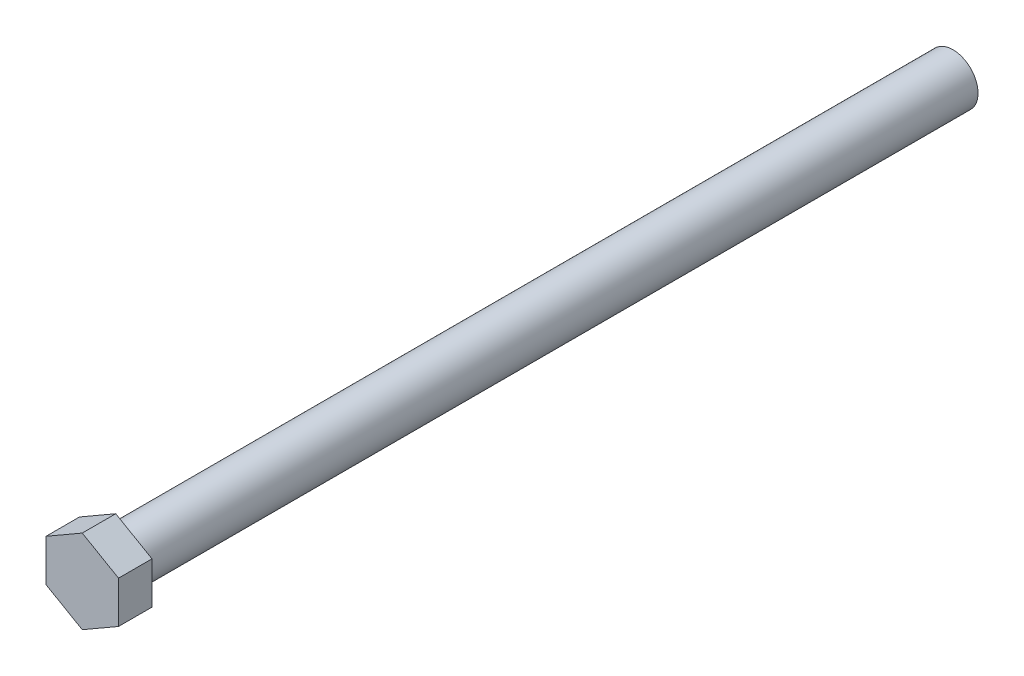
ISO-10303-21;
HEADER;
FILE_DESCRIPTION(('STEP AP214'),'2;1');
FILE_NAME('part.step','',(''),(''),'','','');
FILE_SCHEMA(('AUTOMOTIVE_DESIGN { 1 0 10303 214 1 1 1 1 }'));
ENDSEC;
DATA;
#1=APPLICATION_CONTEXT('core data for automotive mechanical design processes');
#2=APPLICATION_PROTOCOL_DEFINITION('international standard','automotive_design',2000,#1);
#3=PRODUCT_CONTEXT('',#1,'mechanical');
#4=PRODUCT('Part','Part','',(#3));
#5=PRODUCT_RELATED_PRODUCT_CATEGORY('part','',(#4));
#6=PRODUCT_DEFINITION_FORMATION('','',#4);
#7=PRODUCT_DEFINITION_CONTEXT('part definition',#1,'design');
#8=PRODUCT_DEFINITION('design','',#6,#7);
#9=PRODUCT_DEFINITION_SHAPE('','',#8);
#10=(LENGTH_UNIT() NAMED_UNIT(*) SI_UNIT(.MILLI.,.METRE.));
#11=(NAMED_UNIT(*) PLANE_ANGLE_UNIT() SI_UNIT($,.RADIAN.));
#12=(NAMED_UNIT(*) SI_UNIT($,.STERADIAN.) SOLID_ANGLE_UNIT());
#13=UNCERTAINTY_MEASURE_WITH_UNIT(LENGTH_MEASURE(1.E-05),#10,'distance_accuracy_value','');
#14=(GEOMETRIC_REPRESENTATION_CONTEXT(3) GLOBAL_UNCERTAINTY_ASSIGNED_CONTEXT((#13)) GLOBAL_UNIT_ASSIGNED_CONTEXT((#10,
#11,#12)) REPRESENTATION_CONTEXT('',''));
#15=CARTESIAN_POINT('',(0.,0.,0.));
#16=DIRECTION('',(0.,0.,1.));
#17=DIRECTION('',(1.,0.,0.));
#18=AXIS2_PLACEMENT_3D('',#15,#16,#17);
#19=CARTESIAN_POINT('',(0.,5.,4.));
#20=DIRECTION('',(0.5,-0.866025403784439,0.));
#21=DIRECTION('',(0.866025403784439,0.5,0.));
#22=AXIS2_PLACEMENT_3D('',#19,#20,#21);
#23=PLANE('',#22);
#24=DIRECTION('',(-0.866025403784439,-0.5,0.));
#25=VECTOR('',#24,1.);
#26=CARTESIAN_POINT('',(0.,5.,0.));
#27=LINE('',#26,#25);
#28=CARTESIAN_POINT('',(0.,5.,0.));
#29=VERTEX_POINT('',#28);
#30=CARTESIAN_POINT('',(-4.3301270189222,2.5,0.));
#31=VERTEX_POINT('',#30);
#32=EDGE_CURVE('E136',#29,#31,#27,.T.);
#33=ORIENTED_EDGE('',*,*,#32,.T.);
#34=DIRECTION('',(0.,0.,-1.));
#35=VECTOR('',#34,1.);
#36=CARTESIAN_POINT('',(-4.3301270189222,2.5,4.));
#37=LINE('',#36,#35);
#38=CARTESIAN_POINT('',(-4.3301270189222,2.5,4.));
#39=VERTEX_POINT('',#38);
#40=EDGE_CURVE('E48',#39,#31,#37,.T.);
#41=ORIENTED_EDGE('',*,*,#40,.F.);
#42=DIRECTION('',(-0.866025403784439,-0.5,0.));
#43=VECTOR('',#42,1.);
#44=CARTESIAN_POINT('',(0.,5.,4.));
#45=LINE('',#44,#43);
#46=CARTESIAN_POINT('',(0.,5.,4.));
#47=VERTEX_POINT('',#46);
#48=EDGE_CURVE('E153',#47,#39,#45,.T.);
#49=ORIENTED_EDGE('',*,*,#48,.F.);
#50=DIRECTION('',(0.,0.,-1.));
#51=VECTOR('',#50,1.);
#52=CARTESIAN_POINT('',(0.,5.,4.));
#53=LINE('',#52,#51);
#54=EDGE_CURVE('E132',#47,#29,#53,.T.);
#55=ORIENTED_EDGE('',*,*,#54,.T.);
#56=EDGE_LOOP('',(#33,#41,#49,#55));
#57=FACE_BOUND('',#56,.T.);
#58=ADVANCED_FACE('F45',(#57),#23,.F.);
#59=CARTESIAN_POINT('',(-4.3301270189222,2.5,4.));
#60=DIRECTION('',(1.,0.,0.));
#61=DIRECTION('',(0.,1.,0.));
#62=AXIS2_PLACEMENT_3D('',#59,#60,#61);
#63=PLANE('',#62);
#64=DIRECTION('',(0.,-1.,0.));
#65=VECTOR('',#64,1.);
#66=CARTESIAN_POINT('',(-4.3301270189222,2.5,0.));
#67=LINE('',#66,#65);
#68=CARTESIAN_POINT('',(-4.3301270189222,-2.5,0.));
#69=VERTEX_POINT('',#68);
#70=EDGE_CURVE('E140',#31,#69,#67,.T.);
#71=ORIENTED_EDGE('',*,*,#70,.T.);
#72=DIRECTION('',(0.,0.,-1.));
#73=VECTOR('',#72,1.);
#74=CARTESIAN_POINT('',(-4.3301270189222,-2.5,4.));
#75=LINE('',#74,#73);
#76=CARTESIAN_POINT('',(-4.3301270189222,-2.5,4.));
#77=VERTEX_POINT('',#76);
#78=EDGE_CURVE('E159',#77,#69,#75,.T.);
#79=ORIENTED_EDGE('',*,*,#78,.F.);
#80=DIRECTION('',(0.,-1.,0.));
#81=VECTOR('',#80,1.);
#82=CARTESIAN_POINT('',(-4.3301270189222,2.5,4.));
#83=LINE('',#82,#81);
#84=EDGE_CURVE('E101',#39,#77,#83,.T.);
#85=ORIENTED_EDGE('',*,*,#84,.F.);
#86=ORIENTED_EDGE('',*,*,#40,.T.);
#87=EDGE_LOOP('',(#71,#79,#85,#86));
#88=FACE_BOUND('',#87,.T.);
#89=ADVANCED_FACE('F166',(#88),#63,.F.);
#90=CARTESIAN_POINT('',(-4.3301270189222,-2.5,4.));
#91=DIRECTION('',(0.5,0.866025403784439,0.));
#92=DIRECTION('',(-0.866025403784439,0.5,0.));
#93=AXIS2_PLACEMENT_3D('',#90,#91,#92);
#94=PLANE('',#93);
#95=DIRECTION('',(0.866025403784439,-0.5,0.));
#96=VECTOR('',#95,1.);
#97=CARTESIAN_POINT('',(-4.3301270189222,-2.5,0.));
#98=LINE('',#97,#96);
#99=CARTESIAN_POINT('',(0.,-5.,0.));
#100=VERTEX_POINT('',#99);
#101=EDGE_CURVE('E144',#69,#100,#98,.T.);
#102=ORIENTED_EDGE('',*,*,#101,.T.);
#103=DIRECTION('',(0.,0.,-1.));
#104=VECTOR('',#103,1.);
#105=CARTESIAN_POINT('',(0.,-5.,4.));
#106=LINE('',#105,#104);
#107=CARTESIAN_POINT('',(0.,-5.,4.));
#108=VERTEX_POINT('',#107);
#109=EDGE_CURVE('E125',#108,#100,#106,.T.);
#110=ORIENTED_EDGE('',*,*,#109,.F.);
#111=DIRECTION('',(0.866025403784439,-0.5,0.));
#112=VECTOR('',#111,1.);
#113=CARTESIAN_POINT('',(-4.3301270189222,-2.5,4.));
#114=LINE('',#113,#112);
#115=EDGE_CURVE('E114',#77,#108,#114,.T.);
#116=ORIENTED_EDGE('',*,*,#115,.F.);
#117=ORIENTED_EDGE('',*,*,#78,.T.);
#118=EDGE_LOOP('',(#102,#110,#116,#117));
#119=FACE_BOUND('',#118,.T.);
#120=ADVANCED_FACE('F172',(#119),#94,.F.);
#121=CARTESIAN_POINT('',(0.,-5.,4.));
#122=DIRECTION('',(-0.5,0.866025403784439,0.));
#123=DIRECTION('',(-0.866025403784439,-0.5,0.));
#124=AXIS2_PLACEMENT_3D('',#121,#122,#123);
#125=PLANE('',#124);
#126=DIRECTION('',(0.866025403784439,0.5,0.));
#127=VECTOR('',#126,1.);
#128=CARTESIAN_POINT('',(0.,-5.,0.));
#129=LINE('',#128,#127);
#130=CARTESIAN_POINT('',(4.3301270189222,-2.5,0.));
#131=VERTEX_POINT('',#130);
#132=EDGE_CURVE('E123',#100,#131,#129,.T.);
#133=ORIENTED_EDGE('',*,*,#132,.T.);
#134=DIRECTION('',(0.,0.,-1.));
#135=VECTOR('',#134,1.);
#136=CARTESIAN_POINT('',(4.3301270189222,-2.5,4.));
#137=LINE('',#136,#135);
#138=CARTESIAN_POINT('',(4.3301270189222,-2.5,4.));
#139=VERTEX_POINT('',#138);
#140=EDGE_CURVE('E120',#139,#131,#137,.T.);
#141=ORIENTED_EDGE('',*,*,#140,.F.);
#142=DIRECTION('',(0.866025403784439,0.5,0.));
#143=VECTOR('',#142,1.);
#144=CARTESIAN_POINT('',(0.,-5.,4.));
#145=LINE('',#144,#143);
#146=EDGE_CURVE('E108',#108,#139,#145,.T.);
#147=ORIENTED_EDGE('',*,*,#146,.F.);
#148=ORIENTED_EDGE('',*,*,#109,.T.);
#149=EDGE_LOOP('',(#133,#141,#147,#148));
#150=FACE_BOUND('',#149,.T.);
#151=ADVANCED_FACE('F121',(#150),#125,.F.);
#152=CARTESIAN_POINT('',(4.3301270189222,-2.5,4.));
#153=DIRECTION('',(-1.,0.,0.));
#154=DIRECTION('',(0.,-1.,0.));
#155=AXIS2_PLACEMENT_3D('',#152,#153,#154);
#156=PLANE('',#155);
#157=DIRECTION('',(0.,1.,0.));
#158=VECTOR('',#157,1.);
#159=CARTESIAN_POINT('',(4.3301270189222,-2.5,0.));
#160=LINE('',#159,#158);
#161=CARTESIAN_POINT('',(4.3301270189222,2.5,0.));
#162=VERTEX_POINT('',#161);
#163=EDGE_CURVE('E86',#131,#162,#160,.T.);
#164=ORIENTED_EDGE('',*,*,#163,.T.);
#165=DIRECTION('',(0.,0.,-1.));
#166=VECTOR('',#165,1.);
#167=CARTESIAN_POINT('',(4.3301270189222,2.5,4.));
#168=LINE('',#167,#166);
#169=CARTESIAN_POINT('',(4.3301270189222,2.5,4.));
#170=VERTEX_POINT('',#169);
#171=EDGE_CURVE('E126',#170,#162,#168,.T.);
#172=ORIENTED_EDGE('',*,*,#171,.F.);
#173=DIRECTION('',(0.,1.,0.));
#174=VECTOR('',#173,1.);
#175=CARTESIAN_POINT('',(4.3301270189222,-2.5,4.));
#176=LINE('',#175,#174);
#177=EDGE_CURVE('E112',#139,#170,#176,.T.);
#178=ORIENTED_EDGE('',*,*,#177,.F.);
#179=ORIENTED_EDGE('',*,*,#140,.T.);
#180=EDGE_LOOP('',(#164,#172,#178,#179));
#181=FACE_BOUND('',#180,.T.);
#182=ADVANCED_FACE('F128',(#181),#156,.F.);
#183=CARTESIAN_POINT('',(4.3301270189222,2.5,4.));
#184=DIRECTION('',(-0.5,-0.866025403784439,0.));
#185=DIRECTION('',(0.866025403784439,-0.5,0.));
#186=AXIS2_PLACEMENT_3D('',#183,#184,#185);
#187=PLANE('',#186);
#188=DIRECTION('',(-0.866025403784439,0.5,0.));
#189=VECTOR('',#188,1.);
#190=CARTESIAN_POINT('',(4.3301270189222,2.5,0.));
#191=LINE('',#190,#189);
#192=EDGE_CURVE('E92',#162,#29,#191,.T.);
#193=ORIENTED_EDGE('',*,*,#192,.T.);
#194=ORIENTED_EDGE('',*,*,#54,.F.);
#195=DIRECTION('',(-0.866025403784439,0.5,0.));
#196=VECTOR('',#195,1.);
#197=CARTESIAN_POINT('',(4.3301270189222,2.5,4.));
#198=LINE('',#197,#196);
#199=EDGE_CURVE('E63',#170,#47,#198,.T.);
#200=ORIENTED_EDGE('',*,*,#199,.F.);
#201=ORIENTED_EDGE('',*,*,#171,.T.);
#202=EDGE_LOOP('',(#193,#194,#200,#201));
#203=FACE_BOUND('',#202,.T.);
#204=ADVANCED_FACE('F196',(#203),#187,.F.);
#205=CARTESIAN_POINT('',(0.,0.,4.));
#206=DIRECTION('',(0.,0.,1.));
#207=DIRECTION('',(1.,0.,0.));
#208=AXIS2_PLACEMENT_3D('',#205,#206,#207);
#209=PLANE('',#208);
#210=ORIENTED_EDGE('',*,*,#48,.T.);
#211=ORIENTED_EDGE('',*,*,#84,.T.);
#212=ORIENTED_EDGE('',*,*,#115,.T.);
#213=ORIENTED_EDGE('',*,*,#146,.T.);
#214=ORIENTED_EDGE('',*,*,#177,.T.);
#215=ORIENTED_EDGE('',*,*,#199,.T.);
#216=EDGE_LOOP('',(#210,#211,#212,#213,#214,#215));
#217=FACE_BOUND('',#216,.T.);
#218=ADVANCED_FACE('F110',(#217),#209,.T.);
#219=CARTESIAN_POINT('',(0.,0.,0.));
#220=DIRECTION('',(0.,0.,1.));
#221=DIRECTION('',(1.,0.,0.));
#222=AXIS2_PLACEMENT_3D('',#219,#220,#221);
#223=PLANE('',#222);
#224=CARTESIAN_POINT('',(0.,0.,0.));
#225=DIRECTION('',(0.,0.,-1.));
#226=DIRECTION('',(-1.,0.,0.));
#227=AXIS2_PLACEMENT_3D('',#224,#225,#226);
#228=CIRCLE('',#227,3.);
#229=CARTESIAN_POINT('',(-3.,0.,0.));
#230=VERTEX_POINT('',#229);
#231=EDGE_CURVE('E11',#230,#230,#228,.T.);
#232=ORIENTED_EDGE('',*,*,#231,.F.);
#233=EDGE_LOOP('',(#232));
#234=FACE_BOUND('',#233,.T.);
#235=ORIENTED_EDGE('',*,*,#32,.F.);
#236=ORIENTED_EDGE('',*,*,#192,.F.);
#237=ORIENTED_EDGE('',*,*,#163,.F.);
#238=ORIENTED_EDGE('',*,*,#132,.F.);
#239=ORIENTED_EDGE('',*,*,#101,.F.);
#240=ORIENTED_EDGE('',*,*,#70,.F.);
#241=EDGE_LOOP('',(#235,#236,#237,#238,#239,#240));
#242=FACE_BOUND('',#241,.T.);
#243=ADVANCED_FACE('F171',(#234,#242),#223,.F.);
#244=CARTESIAN_POINT('',(0.,0.,-100.));
#245=DIRECTION('',(0.,0.,1.));
#246=DIRECTION('',(1.,0.,0.));
#247=AXIS2_PLACEMENT_3D('',#244,#245,#246);
#248=CYLINDRICAL_SURFACE('',#247,3.);
#249=CARTESIAN_POINT('',(0.,0.,-100.));
#250=DIRECTION('',(0.,0.,-1.));
#251=DIRECTION('',(-1.,0.,0.));
#252=AXIS2_PLACEMENT_3D('',#249,#250,#251);
#253=CIRCLE('',#252,3.);
#254=CARTESIAN_POINT('',(-3.,0.,-100.));
#255=VERTEX_POINT('',#254);
#256=EDGE_CURVE('E141',#255,#255,#253,.T.);
#257=ORIENTED_EDGE('',*,*,#256,.F.);
#258=EDGE_LOOP('',(#257));
#259=FACE_BOUND('',#258,.T.);
#260=ORIENTED_EDGE('',*,*,#231,.T.);
#261=EDGE_LOOP('',(#260));
#262=FACE_BOUND('',#261,.T.);
#263=ADVANCED_FACE('F185',(#259,#262),#248,.T.);
#264=CARTESIAN_POINT('',(0.,0.,-100.));
#265=DIRECTION('',(0.,0.,-1.));
#266=DIRECTION('',(-1.,0.,0.));
#267=AXIS2_PLACEMENT_3D('',#264,#265,#266);
#268=PLANE('',#267);
#269=ORIENTED_EDGE('',*,*,#256,.T.);
#270=EDGE_LOOP('',(#269));
#271=FACE_BOUND('',#270,.T.);
#272=ADVANCED_FACE('F183',(#271),#268,.T.);
#273=CLOSED_SHELL('',(#58,#89,#120,#151,#182,#204,#218,#243,#263,#272));
#274=MANIFOLD_SOLID_BREP('B2',#273);
#275=ADVANCED_BREP_SHAPE_REPRESENTATION('',(#18,#274),#14);
#276=SHAPE_DEFINITION_REPRESENTATION(#9,#275);
ENDSEC;
END-ISO-10303-21;
